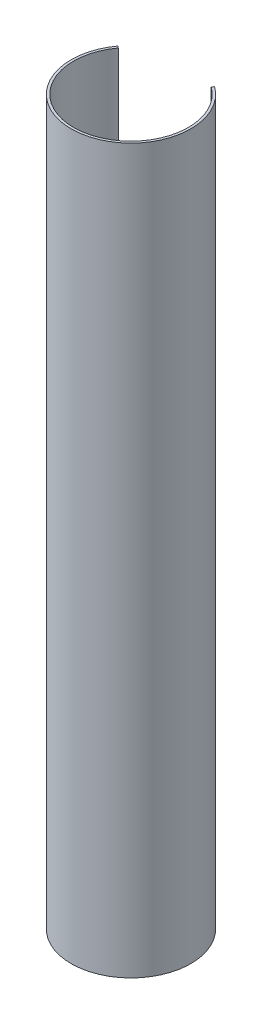
ISO-10303-21;
HEADER;
FILE_DESCRIPTION(('STEP AP214'),'2;1');
FILE_NAME('part.step','',(''),(''),'','','');
FILE_SCHEMA(('AUTOMOTIVE_DESIGN { 1 0 10303 214 1 1 1 1 }'));
ENDSEC;
DATA;
#1=APPLICATION_CONTEXT('core data for automotive mechanical design processes');
#2=APPLICATION_PROTOCOL_DEFINITION('international standard','automotive_design',2000,#1);
#3=PRODUCT_CONTEXT('',#1,'mechanical');
#4=PRODUCT('Part','Part','',(#3));
#5=PRODUCT_RELATED_PRODUCT_CATEGORY('part','',(#4));
#6=PRODUCT_DEFINITION_FORMATION('','',#4);
#7=PRODUCT_DEFINITION_CONTEXT('part definition',#1,'design');
#8=PRODUCT_DEFINITION('design','',#6,#7);
#9=PRODUCT_DEFINITION_SHAPE('','',#8);
#10=(LENGTH_UNIT() NAMED_UNIT(*) SI_UNIT(.MILLI.,.METRE.));
#11=(NAMED_UNIT(*) PLANE_ANGLE_UNIT() SI_UNIT($,.RADIAN.));
#12=(NAMED_UNIT(*) SI_UNIT($,.STERADIAN.) SOLID_ANGLE_UNIT());
#13=UNCERTAINTY_MEASURE_WITH_UNIT(LENGTH_MEASURE(1.E-05),#10,'distance_accuracy_value','');
#14=(GEOMETRIC_REPRESENTATION_CONTEXT(3) GLOBAL_UNCERTAINTY_ASSIGNED_CONTEXT((#13)) GLOBAL_UNIT_ASSIGNED_CONTEXT((#10,
#11,#12)) REPRESENTATION_CONTEXT('',''));
#15=CARTESIAN_POINT('',(0.,0.,0.));
#16=DIRECTION('',(0.,0.,1.));
#17=DIRECTION('',(1.,0.,0.));
#18=AXIS2_PLACEMENT_3D('',#15,#16,#17);
#19=CARTESIAN_POINT('',(0.,1510.,0.));
#20=DIRECTION('',(0.,-1.,0.));
#21=DIRECTION('',(0.,0.,-1.));
#22=AXIS2_PLACEMENT_3D('',#19,#20,#21);
#23=CYLINDRICAL_SURFACE('',#22,120.);
#24=CARTESIAN_POINT('',(0.,0.,0.));
#25=DIRECTION('',(0.,1.,0.));
#26=DIRECTION('',(0.,0.,1.));
#27=AXIS2_PLACEMENT_3D('',#24,#25,#26);
#28=CIRCLE('',#27,120.);
#29=CARTESIAN_POINT('',(-97.0676055388381,0.,-70.5540924040309));
#30=VERTEX_POINT('',#29);
#31=CARTESIAN_POINT('',(70.5540924040309,0.,-97.0676055388381));
#32=VERTEX_POINT('',#31);
#33=EDGE_CURVE('E105',#30,#32,#28,.T.);
#34=ORIENTED_EDGE('',*,*,#33,.F.);
#35=DIRECTION('',(0.,-1.,0.));
#36=VECTOR('',#35,1.);
#37=CARTESIAN_POINT('',(-97.0676055388381,1510.,-70.5540924040309));
#38=LINE('',#37,#36);
#39=CARTESIAN_POINT('',(-97.0676055388381,1510.,-70.5540924040309));
#40=VERTEX_POINT('',#39);
#41=EDGE_CURVE('E11',#40,#30,#38,.T.);
#42=ORIENTED_EDGE('',*,*,#41,.F.);
#43=CARTESIAN_POINT('',(0.,1510.,0.));
#44=DIRECTION('',(0.,1.,0.));
#45=DIRECTION('',(0.,0.,1.));
#46=AXIS2_PLACEMENT_3D('',#43,#44,#45);
#47=CIRCLE('',#46,120.);
#48=CARTESIAN_POINT('',(70.5540924040309,1510.,-97.0676055388381));
#49=VERTEX_POINT('',#48);
#50=EDGE_CURVE('E99',#40,#49,#47,.T.);
#51=ORIENTED_EDGE('',*,*,#50,.T.);
#52=DIRECTION('',(0.,-1.,0.));
#53=VECTOR('',#52,1.);
#54=CARTESIAN_POINT('',(70.5540924040309,1510.,-97.0676055388381));
#55=LINE('',#54,#53);
#56=EDGE_CURVE('E57',#49,#32,#55,.T.);
#57=ORIENTED_EDGE('',*,*,#56,.T.);
#58=EDGE_LOOP('',(#34,#42,#51,#57));
#59=FACE_BOUND('',#58,.T.);
#60=ADVANCED_FACE('F41',(#59),#23,.F.);
#61=CARTESIAN_POINT('',(0.,1510.,0.));
#62=DIRECTION('',(0.587950770033591,0.,-0.80889671282365));
#63=DIRECTION('',(-0.80889671282365,0.,-0.587950770033591));
#64=AXIS2_PLACEMENT_3D('',#61,#62,#63);
#65=PLANE('',#64);
#66=DIRECTION('',(0.808896712823651,0.,0.587950770033591));
#67=VECTOR('',#66,1.);
#68=CARTESIAN_POINT('',(0.,0.,0.));
#69=LINE('',#68,#67);
#70=CARTESIAN_POINT('',(-101.112089102956,0.,-73.4938462541989));
#71=VERTEX_POINT('',#70);
#72=EDGE_CURVE('E89',#71,#30,#69,.T.);
#73=ORIENTED_EDGE('',*,*,#72,.F.);
#74=DIRECTION('',(0.,-1.,0.));
#75=VECTOR('',#74,1.);
#76=CARTESIAN_POINT('',(-101.112089102956,1510.,-73.4938462541989));
#77=LINE('',#76,#75);
#78=CARTESIAN_POINT('',(-101.112089102956,1510.,-73.4938462541989));
#79=VERTEX_POINT('',#78);
#80=EDGE_CURVE('E49',#79,#71,#77,.T.);
#81=ORIENTED_EDGE('',*,*,#80,.F.);
#82=DIRECTION('',(0.808896712823651,0.,0.587950770033591));
#83=VECTOR('',#82,1.);
#84=CARTESIAN_POINT('',(0.,1510.,0.));
#85=LINE('',#84,#83);
#86=EDGE_CURVE('E87',#79,#40,#85,.T.);
#87=ORIENTED_EDGE('',*,*,#86,.T.);
#88=ORIENTED_EDGE('',*,*,#41,.T.);
#89=EDGE_LOOP('',(#73,#81,#87,#88));
#90=FACE_BOUND('',#89,.T.);
#91=ADVANCED_FACE('F85',(#90),#65,.T.);
#92=CARTESIAN_POINT('',(0.,1510.,0.));
#93=DIRECTION('',(0.,-1.,0.));
#94=DIRECTION('',(0.,0.,-1.));
#95=AXIS2_PLACEMENT_3D('',#92,#93,#94);
#96=CYLINDRICAL_SURFACE('',#95,125.);
#97=CARTESIAN_POINT('',(0.,0.,0.));
#98=DIRECTION('',(0.,1.,0.));
#99=DIRECTION('',(0.,0.,1.));
#100=AXIS2_PLACEMENT_3D('',#97,#98,#99);
#101=CIRCLE('',#100,125.);
#102=CARTESIAN_POINT('',(73.4938462541989,0.,-101.112089102956));
#103=VERTEX_POINT('',#102);
#104=EDGE_CURVE('E108',#71,#103,#101,.T.);
#105=ORIENTED_EDGE('',*,*,#104,.T.);
#106=DIRECTION('',(0.,-1.,0.));
#107=VECTOR('',#106,1.);
#108=CARTESIAN_POINT('',(73.4938462541989,1510.,-101.112089102956));
#109=LINE('',#108,#107);
#110=CARTESIAN_POINT('',(73.4938462541989,1510.,-101.112089102956));
#111=VERTEX_POINT('',#110);
#112=EDGE_CURVE('E71',#111,#103,#109,.T.);
#113=ORIENTED_EDGE('',*,*,#112,.F.);
#114=CARTESIAN_POINT('',(0.,1510.,0.));
#115=DIRECTION('',(0.,1.,0.));
#116=DIRECTION('',(0.,0.,1.));
#117=AXIS2_PLACEMENT_3D('',#114,#115,#116);
#118=CIRCLE('',#117,125.);
#119=EDGE_CURVE('E92',#79,#111,#118,.T.);
#120=ORIENTED_EDGE('',*,*,#119,.F.);
#121=ORIENTED_EDGE('',*,*,#80,.T.);
#122=EDGE_LOOP('',(#105,#113,#120,#121));
#123=FACE_BOUND('',#122,.T.);
#124=ADVANCED_FACE('F93',(#123),#96,.T.);
#125=CARTESIAN_POINT('',(0.,1510.,0.));
#126=DIRECTION('',(-0.80889671282365,0.,-0.587950770033591));
#127=DIRECTION('',(-0.587950770033591,0.,0.80889671282365));
#128=AXIS2_PLACEMENT_3D('',#125,#126,#127);
#129=PLANE('',#128);
#130=DIRECTION('',(0.587950770033591,0.,-0.808896712823651));
#131=VECTOR('',#130,1.);
#132=CARTESIAN_POINT('',(0.,0.,0.));
#133=LINE('',#132,#131);
#134=EDGE_CURVE('E101',#32,#103,#133,.T.);
#135=ORIENTED_EDGE('',*,*,#134,.F.);
#136=ORIENTED_EDGE('',*,*,#56,.F.);
#137=DIRECTION('',(0.587950770033591,0.,-0.808896712823651));
#138=VECTOR('',#137,1.);
#139=CARTESIAN_POINT('',(0.,1510.,0.));
#140=LINE('',#139,#138);
#141=EDGE_CURVE('E96',#49,#111,#140,.T.);
#142=ORIENTED_EDGE('',*,*,#141,.T.);
#143=ORIENTED_EDGE('',*,*,#112,.T.);
#144=EDGE_LOOP('',(#135,#136,#142,#143));
#145=FACE_BOUND('',#144,.T.);
#146=ADVANCED_FACE('F115',(#145),#129,.T.);
#147=CARTESIAN_POINT('',(0.,1510.,0.));
#148=DIRECTION('',(0.,1.,0.));
#149=DIRECTION('',(0.,0.,1.));
#150=AXIS2_PLACEMENT_3D('',#147,#148,#149);
#151=PLANE('',#150);
#152=ORIENTED_EDGE('',*,*,#50,.F.);
#153=ORIENTED_EDGE('',*,*,#86,.F.);
#154=ORIENTED_EDGE('',*,*,#119,.T.);
#155=ORIENTED_EDGE('',*,*,#141,.F.);
#156=EDGE_LOOP('',(#152,#153,#154,#155));
#157=FACE_BOUND('',#156,.T.);
#158=ADVANCED_FACE('F98',(#157),#151,.T.);
#159=CARTESIAN_POINT('',(0.,0.,0.));
#160=DIRECTION('',(0.,1.,0.));
#161=DIRECTION('',(0.,0.,1.));
#162=AXIS2_PLACEMENT_3D('',#159,#160,#161);
#163=PLANE('',#162);
#164=ORIENTED_EDGE('',*,*,#33,.T.);
#165=ORIENTED_EDGE('',*,*,#134,.T.);
#166=ORIENTED_EDGE('',*,*,#104,.F.);
#167=ORIENTED_EDGE('',*,*,#72,.T.);
#168=EDGE_LOOP('',(#164,#165,#166,#167));
#169=FACE_BOUND('',#168,.T.);
#170=ADVANCED_FACE('F114',(#169),#163,.F.);
#171=CLOSED_SHELL('',(#60,#91,#124,#146,#158,#170));
#172=MANIFOLD_SOLID_BREP('B2',#171);
#173=ADVANCED_BREP_SHAPE_REPRESENTATION('',(#18,#172),#14);
#174=SHAPE_DEFINITION_REPRESENTATION(#9,#173);
ENDSEC;
END-ISO-10303-21;
